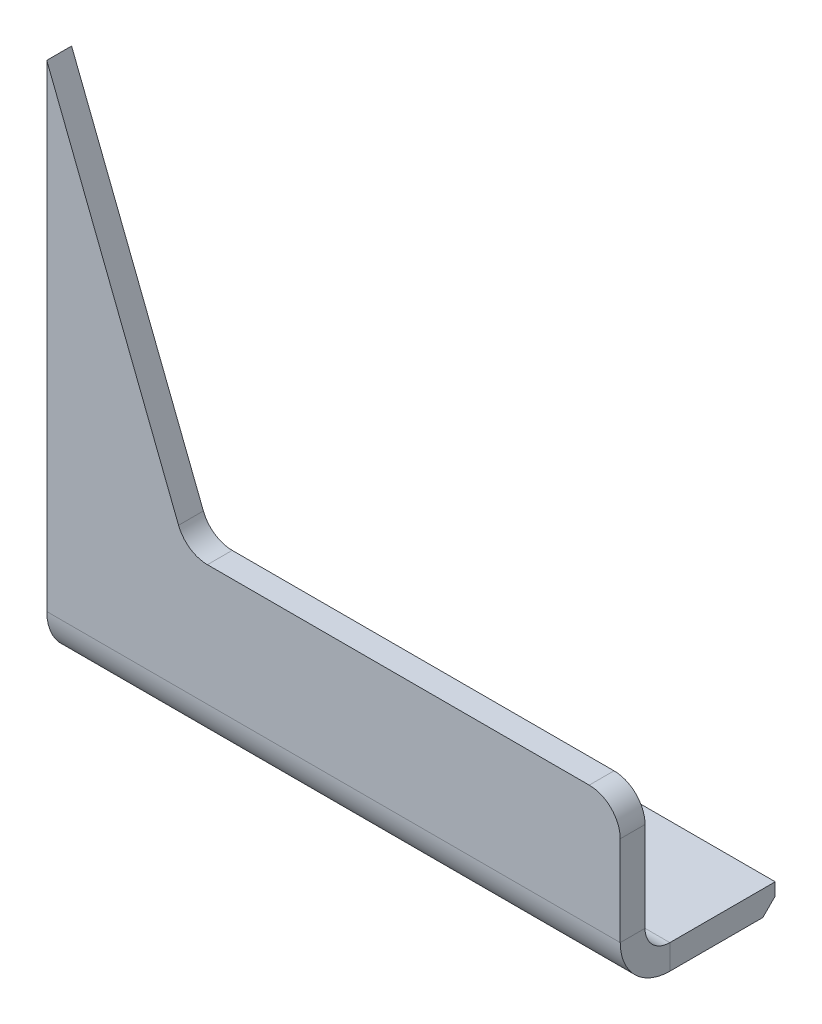
ISO-10303-21;
HEADER;
FILE_DESCRIPTION(('STEP AP214'),'2;1');
FILE_NAME('part.step','',(''),(''),'','','');
FILE_SCHEMA(('AUTOMOTIVE_DESIGN { 1 0 10303 214 1 1 1 1 }'));
ENDSEC;
DATA;
#1=APPLICATION_CONTEXT('core data for automotive mechanical design processes');
#2=APPLICATION_PROTOCOL_DEFINITION('international standard','automotive_design',2000,#1);
#3=PRODUCT_CONTEXT('',#1,'mechanical');
#4=PRODUCT('Part','Part','',(#3));
#5=PRODUCT_RELATED_PRODUCT_CATEGORY('part','',(#4));
#6=PRODUCT_DEFINITION_FORMATION('','',#4);
#7=PRODUCT_DEFINITION_CONTEXT('part definition',#1,'design');
#8=PRODUCT_DEFINITION('design','',#6,#7);
#9=PRODUCT_DEFINITION_SHAPE('','',#8);
#10=(LENGTH_UNIT() NAMED_UNIT(*) SI_UNIT(.MILLI.,.METRE.));
#11=(NAMED_UNIT(*) PLANE_ANGLE_UNIT() SI_UNIT($,.RADIAN.));
#12=(NAMED_UNIT(*) SI_UNIT($,.STERADIAN.) SOLID_ANGLE_UNIT());
#13=UNCERTAINTY_MEASURE_WITH_UNIT(LENGTH_MEASURE(1.E-05),#10,'distance_accuracy_value','');
#14=(GEOMETRIC_REPRESENTATION_CONTEXT(3) GLOBAL_UNCERTAINTY_ASSIGNED_CONTEXT((#13)) GLOBAL_UNIT_ASSIGNED_CONTEXT((#10,
#11,#12)) REPRESENTATION_CONTEXT('',''));
#15=CARTESIAN_POINT('',(0.,0.,0.));
#16=DIRECTION('',(0.,0.,1.));
#17=DIRECTION('',(1.,0.,0.));
#18=AXIS2_PLACEMENT_3D('',#15,#16,#17);
#19=CARTESIAN_POINT('',(0.,0.,-8.00000000000001));
#20=DIRECTION('',(-1.,0.,0.));
#21=DIRECTION('',(0.,-0.999999999999972,0.));
#22=AXIS2_PLACEMENT_3D('',#19,#20,#21);
#23=PLANE('',#22);
#24=DIRECTION('',(0.,-0.999999999999972,0.));
#25=VECTOR('',#24,1.);
#26=CARTESIAN_POINT('',(0.,0.,-8.00000000000001));
#27=LINE('',#26,#25);
#28=CARTESIAN_POINT('',(0.,0.,-8.00000000000001));
#29=VERTEX_POINT('',#28);
#30=CARTESIAN_POINT('',(0.,-153.999999999995,-8.00000000000001));
#31=VERTEX_POINT('',#30);
#32=EDGE_CURVE('E200',#29,#31,#27,.T.);
#33=ORIENTED_EDGE('',*,*,#32,.T.);
#34=DIRECTION('',(0.,0.,0.999999999999972));
#35=VECTOR('',#34,1.);
#36=CARTESIAN_POINT('',(0.,-153.999999999995,-8.00000000000001));
#37=LINE('',#36,#35);
#38=CARTESIAN_POINT('',(0.,-153.999999999995,0.));
#39=VERTEX_POINT('',#38);
#40=EDGE_CURVE('E187',#31,#39,#37,.T.);
#41=ORIENTED_EDGE('',*,*,#40,.T.);
#42=DIRECTION('',(0.,-0.999999999999972,0.));
#43=VECTOR('',#42,1.);
#44=CARTESIAN_POINT('',(0.,0.,0.));
#45=LINE('',#44,#43);
#46=CARTESIAN_POINT('',(0.,0.,0.));
#47=VERTEX_POINT('',#46);
#48=EDGE_CURVE('E198',#47,#39,#45,.T.);
#49=ORIENTED_EDGE('',*,*,#48,.F.);
#50=DIRECTION('',(0.,0.,0.999999999999972));
#51=VECTOR('',#50,1.);
#52=CARTESIAN_POINT('',(0.,0.,-8.00000000000001));
#53=LINE('',#52,#51);
#54=EDGE_CURVE('E212',#29,#47,#53,.T.);
#55=ORIENTED_EDGE('',*,*,#54,.F.);
#56=EDGE_LOOP('',(#33,#41,#49,#55));
#57=FACE_BOUND('',#56,.T.);
#58=ADVANCED_FACE('F58',(#57),#23,.T.);
#59=CARTESIAN_POINT('',(0.,0.,-8.00000000000001));
#60=DIRECTION('',(0.,0.,0.999999999999972));
#61=DIRECTION('',(1.,0.,0.));
#62=AXIS2_PLACEMENT_3D('',#59,#60,#61);
#63=PLANE('',#62);
#64=DIRECTION('',(-1.,0.,0.));
#65=VECTOR('',#64,1.);
#66=CARTESIAN_POINT('',(44.9999999999999,-114.999999999995,-8.00000000000001));
#67=LINE('',#66,#65);
#68=CARTESIAN_POINT('',(175.,-114.999999999995,-8.00000000000001));
#69=VERTEX_POINT('',#68);
#70=CARTESIAN_POINT('',(51.8252948132423,-114.999999999997,-8.00000000000001));
#71=VERTEX_POINT('',#70);
#72=EDGE_CURVE('E207',#69,#71,#67,.T.);
#73=ORIENTED_EDGE('',*,*,#72,.F.);
#74=CARTESIAN_POINT('',(175.,-124.999999999995,-8.00000000000001));
#75=DIRECTION('',(0.,0.,0.999999999999972));
#76=DIRECTION('',(1.,0.,0.));
#77=AXIS2_PLACEMENT_3D('',#74,#75,#76);
#78=CIRCLE('',#77,10.);
#79=CARTESIAN_POINT('',(185.,-124.999999999995,-8.00000000000001));
#80=VERTEX_POINT('',#79);
#81=EDGE_CURVE('E234',#69,#80,#78,.F.);
#82=ORIENTED_EDGE('',*,*,#81,.T.);
#83=DIRECTION('',(0.,0.999999999999972,0.));
#84=VECTOR('',#83,1.);
#85=CARTESIAN_POINT('',(185.,-114.999999999995,-8.00000000000001));
#86=LINE('',#85,#84);
#87=CARTESIAN_POINT('',(185.,-153.999999999995,-8.00000000000001));
#88=VERTEX_POINT('',#87);
#89=EDGE_CURVE('E203',#88,#80,#86,.T.);
#90=ORIENTED_EDGE('',*,*,#89,.F.);
#91=DIRECTION('',(-1.,0.,0.));
#92=VECTOR('',#91,1.);
#93=CARTESIAN_POINT('',(0.,-153.999999999995,-8.00000000000001));
#94=LINE('',#93,#92);
#95=EDGE_CURVE('E191',#31,#88,#94,.F.);
#96=ORIENTED_EDGE('',*,*,#95,.F.);
#97=ORIENTED_EDGE('',*,*,#32,.F.);
#98=DIRECTION('',(-0.364399348580512,0.931242779705726,0.));
#99=VECTOR('',#98,1.);
#100=CARTESIAN_POINT('',(0.,0.,-8.00000000000001));
#101=LINE('',#100,#99);
#102=CARTESIAN_POINT('',(42.5128670161847,-108.643993485802,-8.00000000000001));
#103=VERTEX_POINT('',#102);
#104=EDGE_CURVE('E210',#103,#29,#101,.T.);
#105=ORIENTED_EDGE('',*,*,#104,.F.);
#106=CARTESIAN_POINT('',(51.8252948132423,-104.999999999997,-8.00000000000001));
#107=DIRECTION('',(0.,0.,0.999999999999972));
#108=DIRECTION('',(1.,0.,0.));
#109=AXIS2_PLACEMENT_3D('',#106,#107,#108);
#110=CIRCLE('',#109,10.);
#111=EDGE_CURVE('E240',#103,#71,#110,.T.);
#112=ORIENTED_EDGE('',*,*,#111,.T.);
#113=EDGE_LOOP('',(#73,#82,#90,#96,#97,#105,#112));
#114=FACE_BOUND('',#113,.T.);
#115=ADVANCED_FACE('F272',(#114),#63,.F.);
#116=CARTESIAN_POINT('',(0.,0.,0.));
#117=DIRECTION('',(0.,0.,0.999999999999972));
#118=DIRECTION('',(1.,0.,0.));
#119=AXIS2_PLACEMENT_3D('',#116,#117,#118);
#120=PLANE('',#119);
#121=DIRECTION('',(0.,0.999999999999972,0.));
#122=VECTOR('',#121,1.);
#123=CARTESIAN_POINT('',(185.,-114.999999999995,0.));
#124=LINE('',#123,#122);
#125=CARTESIAN_POINT('',(185.,-153.999999999995,0.));
#126=VERTEX_POINT('',#125);
#127=CARTESIAN_POINT('',(185.,-124.999999999995,0.));
#128=VERTEX_POINT('',#127);
#129=EDGE_CURVE('E215',#126,#128,#124,.T.);
#130=ORIENTED_EDGE('',*,*,#129,.T.);
#131=CARTESIAN_POINT('',(175.,-124.999999999995,0.));
#132=DIRECTION('',(0.,0.,0.999999999999972));
#133=DIRECTION('',(1.,0.,0.));
#134=AXIS2_PLACEMENT_3D('',#131,#132,#133);
#135=CIRCLE('',#134,10.);
#136=CARTESIAN_POINT('',(175.,-114.999999999995,0.));
#137=VERTEX_POINT('',#136);
#138=EDGE_CURVE('E227',#128,#137,#135,.T.);
#139=ORIENTED_EDGE('',*,*,#138,.T.);
#140=DIRECTION('',(-1.,0.,0.));
#141=VECTOR('',#140,1.);
#142=CARTESIAN_POINT('',(44.9999999999999,-114.999999999995,0.));
#143=LINE('',#142,#141);
#144=CARTESIAN_POINT('',(51.8252948132423,-114.999999999997,0.));
#145=VERTEX_POINT('',#144);
#146=EDGE_CURVE('E218',#137,#145,#143,.T.);
#147=ORIENTED_EDGE('',*,*,#146,.T.);
#148=CARTESIAN_POINT('',(51.8252948132423,-104.999999999997,0.));
#149=DIRECTION('',(0.,0.,0.999999999999972));
#150=DIRECTION('',(1.,0.,0.));
#151=AXIS2_PLACEMENT_3D('',#148,#149,#150);
#152=CIRCLE('',#151,10.);
#153=CARTESIAN_POINT('',(42.5128670161847,-108.643993485802,0.));
#154=VERTEX_POINT('',#153);
#155=EDGE_CURVE('E238',#145,#154,#152,.F.);
#156=ORIENTED_EDGE('',*,*,#155,.T.);
#157=DIRECTION('',(-0.364399348580512,0.931242779705726,0.));
#158=VECTOR('',#157,1.);
#159=CARTESIAN_POINT('',(0.,0.,0.));
#160=LINE('',#159,#158);
#161=EDGE_CURVE('E204',#154,#47,#160,.T.);
#162=ORIENTED_EDGE('',*,*,#161,.T.);
#163=ORIENTED_EDGE('',*,*,#48,.T.);
#164=DIRECTION('',(-1.,0.,0.));
#165=VECTOR('',#164,1.);
#166=CARTESIAN_POINT('',(0.,-153.999999999995,0.));
#167=LINE('',#166,#165);
#168=EDGE_CURVE('E161',#39,#126,#167,.F.);
#169=ORIENTED_EDGE('',*,*,#168,.T.);
#170=EDGE_LOOP('',(#130,#139,#147,#156,#162,#163,#169));
#171=FACE_BOUND('',#170,.T.);
#172=ADVANCED_FACE('F278',(#171),#120,.T.);
#173=CARTESIAN_POINT('',(0.,0.,-8.00000000000001));
#174=DIRECTION('',(0.931242779705754,0.364399348580505,0.));
#175=DIRECTION('',(-0.364399348580512,0.931242779705726,0.));
#176=AXIS2_PLACEMENT_3D('',#173,#174,#175);
#177=PLANE('',#176);
#178=ORIENTED_EDGE('',*,*,#161,.F.);
#179=DIRECTION('',(0.,0.,0.999999999999972));
#180=VECTOR('',#179,1.);
#181=CARTESIAN_POINT('',(42.5128670161847,-108.643993485802,-8.00000000000001));
#182=LINE('',#181,#180);
#183=EDGE_CURVE('E236',#154,#103,#182,.F.);
#184=ORIENTED_EDGE('',*,*,#183,.T.);
#185=ORIENTED_EDGE('',*,*,#104,.T.);
#186=ORIENTED_EDGE('',*,*,#54,.T.);
#187=EDGE_LOOP('',(#178,#184,#185,#186));
#188=FACE_BOUND('',#187,.T.);
#189=ADVANCED_FACE('F318',(#188),#177,.T.);
#190=CARTESIAN_POINT('',(44.9999999999999,-114.999999999995,-8.00000000000001));
#191=DIRECTION('',(0.,0.999999999999972,0.));
#192=DIRECTION('',(0.,0.,0.999999999999972));
#193=AXIS2_PLACEMENT_3D('',#190,#191,#192);
#194=PLANE('',#193);
#195=ORIENTED_EDGE('',*,*,#146,.F.);
#196=DIRECTION('',(0.,0.,0.999999999999972));
#197=VECTOR('',#196,1.);
#198=CARTESIAN_POINT('',(175.,-114.999999999995,-8.00000000000001));
#199=LINE('',#198,#197);
#200=EDGE_CURVE('E232',#137,#69,#199,.F.);
#201=ORIENTED_EDGE('',*,*,#200,.T.);
#202=ORIENTED_EDGE('',*,*,#72,.T.);
#203=DIRECTION('',(0.,0.,0.999999999999972));
#204=VECTOR('',#203,1.);
#205=CARTESIAN_POINT('',(51.8252948132423,-114.999999999997,0.));
#206=LINE('',#205,#204);
#207=EDGE_CURVE('E229',#71,#145,#206,.T.);
#208=ORIENTED_EDGE('',*,*,#207,.T.);
#209=EDGE_LOOP('',(#195,#201,#202,#208));
#210=FACE_BOUND('',#209,.T.);
#211=ADVANCED_FACE('F317',(#210),#194,.T.);
#212=CARTESIAN_POINT('',(185.,-114.999999999995,-8.00000000000001));
#213=DIRECTION('',(1.,0.,0.));
#214=DIRECTION('',(0.,0.999999999999972,0.));
#215=AXIS2_PLACEMENT_3D('',#212,#213,#214);
#216=PLANE('',#215);
#217=ORIENTED_EDGE('',*,*,#89,.T.);
#218=DIRECTION('',(0.,0.,0.999999999999972));
#219=VECTOR('',#218,1.);
#220=CARTESIAN_POINT('',(185.,-124.999999999995,-8.00000000000001));
#221=LINE('',#220,#219);
#222=EDGE_CURVE('E224',#80,#128,#221,.T.);
#223=ORIENTED_EDGE('',*,*,#222,.T.);
#224=ORIENTED_EDGE('',*,*,#129,.F.);
#225=DIRECTION('',(0.,0.,0.999999999999972));
#226=VECTOR('',#225,1.);
#227=CARTESIAN_POINT('',(185.,-153.999999999995,-8.00000000000001));
#228=LINE('',#227,#226);
#229=EDGE_CURVE('E195',#88,#126,#228,.T.);
#230=ORIENTED_EDGE('',*,*,#229,.F.);
#231=EDGE_LOOP('',(#217,#223,#224,#230));
#232=FACE_BOUND('',#231,.T.);
#233=ADVANCED_FACE('F283',(#232),#216,.T.);
#234=CARTESIAN_POINT('',(185.,-153.999999999995,-16.));
#235=DIRECTION('',(1.,0.,0.));
#236=DIRECTION('',(0.,0.,-0.999999999999972));
#237=AXIS2_PLACEMENT_3D('',#234,#235,#236);
#238=PLANE('',#237);
#239=DIRECTION('',(0.,-0.999999999999972,0.));
#240=VECTOR('',#239,1.);
#241=CARTESIAN_POINT('',(185.,-169.999999999995,-16.));
#242=LINE('',#241,#240);
#243=CARTESIAN_POINT('',(185.,-161.999999999995,-16.));
#244=VERTEX_POINT('',#243);
#245=CARTESIAN_POINT('',(185.,-169.999999999995,-16.));
#246=VERTEX_POINT('',#245);
#247=EDGE_CURVE('E182',#244,#246,#242,.T.);
#248=ORIENTED_EDGE('',*,*,#247,.F.);
#249=CARTESIAN_POINT('',(185.,-153.999999999995,-16.));
#250=DIRECTION('',(-1.,0.,0.));
#251=DIRECTION('',(0.,0.,0.999999999999972));
#252=AXIS2_PLACEMENT_3D('',#249,#250,#251);
#253=CIRCLE('',#252,8.00000000000001);
#254=EDGE_CURVE('E164',#88,#244,#253,.F.);
#255=ORIENTED_EDGE('',*,*,#254,.F.);
#256=ORIENTED_EDGE('',*,*,#229,.T.);
#257=CARTESIAN_POINT('',(185.,-153.999999999995,-16.));
#258=DIRECTION('',(-1.,0.,0.));
#259=DIRECTION('',(0.,0.,0.999999999999972));
#260=AXIS2_PLACEMENT_3D('',#257,#258,#259);
#261=CIRCLE('',#260,16.);
#262=EDGE_CURVE('E186',#126,#246,#261,.F.);
#263=ORIENTED_EDGE('',*,*,#262,.T.);
#264=EDGE_LOOP('',(#248,#255,#256,#263));
#265=FACE_BOUND('',#264,.T.);
#266=ADVANCED_FACE('F302',(#265),#238,.T.);
#267=CARTESIAN_POINT('',(0.,-153.999999999995,-16.));
#268=DIRECTION('',(1.,0.,0.));
#269=DIRECTION('',(0.,0.,-0.999999999999972));
#270=AXIS2_PLACEMENT_3D('',#267,#268,#269);
#271=PLANE('',#270);
#272=CARTESIAN_POINT('',(0.,-153.999999999995,-16.));
#273=DIRECTION('',(-1.,0.,0.));
#274=DIRECTION('',(0.,0.,0.999999999999972));
#275=AXIS2_PLACEMENT_3D('',#272,#273,#274);
#276=CIRCLE('',#275,8.00000000000001);
#277=CARTESIAN_POINT('',(0.,-161.999999999995,-16.));
#278=VERTEX_POINT('',#277);
#279=EDGE_CURVE('E169',#278,#31,#276,.T.);
#280=ORIENTED_EDGE('',*,*,#279,.F.);
#281=DIRECTION('',(0.,-0.999999999999972,0.));
#282=VECTOR('',#281,1.);
#283=CARTESIAN_POINT('',(0.,-161.999999999995,-16.));
#284=LINE('',#283,#282);
#285=CARTESIAN_POINT('',(0.,-169.999999999995,-16.));
#286=VERTEX_POINT('',#285);
#287=EDGE_CURVE('E149',#278,#286,#284,.T.);
#288=ORIENTED_EDGE('',*,*,#287,.T.);
#289=CARTESIAN_POINT('',(0.,-153.999999999995,-16.));
#290=DIRECTION('',(-1.,0.,0.));
#291=DIRECTION('',(0.,0.,0.999999999999972));
#292=AXIS2_PLACEMENT_3D('',#289,#290,#291);
#293=CIRCLE('',#292,16.);
#294=EDGE_CURVE('E156',#286,#39,#293,.T.);
#295=ORIENTED_EDGE('',*,*,#294,.T.);
#296=ORIENTED_EDGE('',*,*,#40,.F.);
#297=EDGE_LOOP('',(#280,#288,#295,#296));
#298=FACE_BOUND('',#297,.T.);
#299=ADVANCED_FACE('F167',(#298),#271,.F.);
#300=CARTESIAN_POINT('',(0.,-153.999999999995,-16.));
#301=DIRECTION('',(-1.,0.,0.));
#302=DIRECTION('',(0.,-0.999999999999972,0.));
#303=AXIS2_PLACEMENT_3D('',#300,#301,#302);
#304=CYLINDRICAL_SURFACE('',#303,16.);
#305=ORIENTED_EDGE('',*,*,#168,.F.);
#306=ORIENTED_EDGE('',*,*,#294,.F.);
#307=DIRECTION('',(-1.,0.,0.));
#308=VECTOR('',#307,1.);
#309=CARTESIAN_POINT('',(0.,-169.999999999995,-16.));
#310=LINE('',#309,#308);
#311=EDGE_CURVE('E158',#246,#286,#310,.T.);
#312=ORIENTED_EDGE('',*,*,#311,.F.);
#313=ORIENTED_EDGE('',*,*,#262,.F.);
#314=EDGE_LOOP('',(#305,#306,#312,#313));
#315=FACE_BOUND('',#314,.T.);
#316=ADVANCED_FACE('F157',(#315),#304,.T.);
#317=CARTESIAN_POINT('',(0.,-153.999999999995,-16.));
#318=DIRECTION('',(-1.,0.,0.));
#319=DIRECTION('',(0.,-0.999999999999972,0.));
#320=AXIS2_PLACEMENT_3D('',#317,#318,#319);
#321=CYLINDRICAL_SURFACE('',#320,8.00000000000001);
#322=ORIENTED_EDGE('',*,*,#95,.T.);
#323=ORIENTED_EDGE('',*,*,#254,.T.);
#324=DIRECTION('',(1.,0.,0.));
#325=VECTOR('',#324,1.);
#326=CARTESIAN_POINT('',(185.,-161.999999999995,-16.));
#327=LINE('',#326,#325);
#328=EDGE_CURVE('E171',#244,#278,#327,.F.);
#329=ORIENTED_EDGE('',*,*,#328,.T.);
#330=ORIENTED_EDGE('',*,*,#279,.T.);
#331=EDGE_LOOP('',(#322,#323,#329,#330));
#332=FACE_BOUND('',#331,.T.);
#333=ADVANCED_FACE('F309',(#332),#321,.F.);
#334=CARTESIAN_POINT('',(0.,-169.999999999995,-8.00000000000001));
#335=DIRECTION('',(-1.,0.,0.));
#336=DIRECTION('',(0.,0.,0.999999999999972));
#337=AXIS2_PLACEMENT_3D('',#334,#335,#336);
#338=PLANE('',#337);
#339=DIRECTION('',(0.,0.999999999999972,0.));
#340=VECTOR('',#339,1.);
#341=CARTESIAN_POINT('',(0.,-169.999999999995,-49.9999999999978));
#342=LINE('',#341,#340);
#343=CARTESIAN_POINT('',(0.,-165.999999999995,-49.9999999999978));
#344=VERTEX_POINT('',#343);
#345=CARTESIAN_POINT('',(0.,-161.999999999995,-49.9999999999978));
#346=VERTEX_POINT('',#345);
#347=EDGE_CURVE('E194',#344,#346,#342,.T.);
#348=ORIENTED_EDGE('',*,*,#347,.F.);
#349=DIRECTION('',(0.,0.707106781186529,-0.707106781186539));
#350=VECTOR('',#349,1.);
#351=CARTESIAN_POINT('',(-9.99200722162641E-13,-188.999999999993,-26.9999999999999));
#352=LINE('',#351,#350);
#353=CARTESIAN_POINT('',(0.,-169.999999999995,-46.));
#354=VERTEX_POINT('',#353);
#355=EDGE_CURVE('E80',#344,#354,#352,.F.);
#356=ORIENTED_EDGE('',*,*,#355,.T.);
#357=DIRECTION('',(0.,0.,0.999999999999972));
#358=VECTOR('',#357,1.);
#359=CARTESIAN_POINT('',(0.,-169.999999999995,-8.00000000000001));
#360=LINE('',#359,#358);
#361=EDGE_CURVE('E144',#354,#286,#360,.T.);
#362=ORIENTED_EDGE('',*,*,#361,.T.);
#363=ORIENTED_EDGE('',*,*,#287,.F.);
#364=DIRECTION('',(0.,0.,-0.999999999999972));
#365=VECTOR('',#364,1.);
#366=CARTESIAN_POINT('',(0.,-161.999999999995,6.66133814775094E-13));
#367=LINE('',#366,#365);
#368=EDGE_CURVE('E253',#346,#278,#367,.F.);
#369=ORIENTED_EDGE('',*,*,#368,.F.);
#370=EDGE_LOOP('',(#348,#356,#362,#363,#369));
#371=FACE_BOUND('',#370,.T.);
#372=ADVANCED_FACE('F146',(#371),#338,.T.);
#373=CARTESIAN_POINT('',(185.,-169.999999999995,-49.9999999999978));
#374=DIRECTION('',(1.,0.,0.));
#375=DIRECTION('',(0.,0.,-0.999999999999972));
#376=AXIS2_PLACEMENT_3D('',#373,#374,#375);
#377=PLANE('',#376);
#378=DIRECTION('',(0.,0.,-0.999999999999972));
#379=VECTOR('',#378,1.);
#380=CARTESIAN_POINT('',(185.,-169.999999999995,-49.9999999999978));
#381=LINE('',#380,#379);
#382=CARTESIAN_POINT('',(185.,-169.999999999995,-46.));
#383=VERTEX_POINT('',#382);
#384=EDGE_CURVE('E152',#246,#383,#381,.T.);
#385=ORIENTED_EDGE('',*,*,#384,.T.);
#386=DIRECTION('',(0.,-0.707106781186529,0.707106781186539));
#387=VECTOR('',#386,1.);
#388=CARTESIAN_POINT('',(185.,-167.999999999995,-48.));
#389=LINE('',#388,#387);
#390=CARTESIAN_POINT('',(185.,-165.999999999995,-49.9999999999978));
#391=VERTEX_POINT('',#390);
#392=EDGE_CURVE('E13',#383,#391,#389,.F.);
#393=ORIENTED_EDGE('',*,*,#392,.T.);
#394=DIRECTION('',(0.,0.999999999999972,0.));
#395=VECTOR('',#394,1.);
#396=CARTESIAN_POINT('',(185.,-169.999999999995,-49.9999999999978));
#397=LINE('',#396,#395);
#398=CARTESIAN_POINT('',(185.,-161.999999999995,-49.9999999999978));
#399=VERTEX_POINT('',#398);
#400=EDGE_CURVE('E151',#391,#399,#397,.T.);
#401=ORIENTED_EDGE('',*,*,#400,.T.);
#402=DIRECTION('',(0.,0.,0.999999999999972));
#403=VECTOR('',#402,1.);
#404=CARTESIAN_POINT('',(185.,-161.999999999995,6.66133814775094E-13));
#405=LINE('',#404,#403);
#406=EDGE_CURVE('E174',#244,#399,#405,.F.);
#407=ORIENTED_EDGE('',*,*,#406,.F.);
#408=ORIENTED_EDGE('',*,*,#247,.T.);
#409=EDGE_LOOP('',(#385,#393,#401,#407,#408));
#410=FACE_BOUND('',#409,.T.);
#411=ADVANCED_FACE('F263',(#410),#377,.T.);
#412=CARTESIAN_POINT('',(0.,-169.999999999995,6.66133814775094E-13));
#413=DIRECTION('',(0.,-0.999999999999972,0.));
#414=DIRECTION('',(0.,0.,-0.999999999999972));
#415=AXIS2_PLACEMENT_3D('',#412,#413,#414);
#416=PLANE('',#415);
#417=ORIENTED_EDGE('',*,*,#361,.F.);
#418=DIRECTION('',(1.,0.,0.));
#419=VECTOR('',#418,1.);
#420=CARTESIAN_POINT('',(0.,-169.999999999995,-46.));
#421=LINE('',#420,#419);
#422=EDGE_CURVE('E66',#354,#383,#421,.T.);
#423=ORIENTED_EDGE('',*,*,#422,.T.);
#424=ORIENTED_EDGE('',*,*,#384,.F.);
#425=ORIENTED_EDGE('',*,*,#311,.T.);
#426=EDGE_LOOP('',(#417,#423,#424,#425));
#427=FACE_BOUND('',#426,.T.);
#428=ADVANCED_FACE('F173',(#427),#416,.T.);
#429=CARTESIAN_POINT('',(0.,-161.999999999995,6.66133814775094E-13));
#430=DIRECTION('',(0.,-0.999999999999972,0.));
#431=DIRECTION('',(0.,0.,-0.999999999999972));
#432=AXIS2_PLACEMENT_3D('',#429,#430,#431);
#433=PLANE('',#432);
#434=ORIENTED_EDGE('',*,*,#328,.F.);
#435=ORIENTED_EDGE('',*,*,#406,.T.);
#436=DIRECTION('',(1.,0.,0.));
#437=VECTOR('',#436,1.);
#438=CARTESIAN_POINT('',(0.,-161.999999999995,-49.9999999999978));
#439=LINE('',#438,#437);
#440=EDGE_CURVE('E177',#399,#346,#439,.F.);
#441=ORIENTED_EDGE('',*,*,#440,.T.);
#442=ORIENTED_EDGE('',*,*,#368,.T.);
#443=EDGE_LOOP('',(#434,#435,#441,#442));
#444=FACE_BOUND('',#443,.T.);
#445=ADVANCED_FACE('F260',(#444),#433,.F.);
#446=CARTESIAN_POINT('',(0.,-169.999999999995,-49.9999999999978));
#447=DIRECTION('',(0.,0.,-0.999999999999972));
#448=DIRECTION('',(0.,0.999999999999972,0.));
#449=AXIS2_PLACEMENT_3D('',#446,#447,#448);
#450=PLANE('',#449);
#451=ORIENTED_EDGE('',*,*,#400,.F.);
#452=DIRECTION('',(-1.,0.,0.));
#453=VECTOR('',#452,1.);
#454=CARTESIAN_POINT('',(0.,-165.999999999995,-49.9999999999978));
#455=LINE('',#454,#453);
#456=EDGE_CURVE('E242',#391,#344,#455,.T.);
#457=ORIENTED_EDGE('',*,*,#456,.T.);
#458=ORIENTED_EDGE('',*,*,#347,.T.);
#459=ORIENTED_EDGE('',*,*,#440,.F.);
#460=EDGE_LOOP('',(#451,#457,#458,#459));
#461=FACE_BOUND('',#460,.T.);
#462=ADVANCED_FACE('F248',(#461),#450,.T.);
#463=CARTESIAN_POINT('',(175.,-124.999999999995,-8.00000000000001));
#464=DIRECTION('',(0.,0.,0.999999999999972));
#465=DIRECTION('',(1.,0.,0.));
#466=AXIS2_PLACEMENT_3D('',#463,#464,#465);
#467=CYLINDRICAL_SURFACE('',#466,10.);
#468=ORIENTED_EDGE('',*,*,#81,.F.);
#469=ORIENTED_EDGE('',*,*,#200,.F.);
#470=ORIENTED_EDGE('',*,*,#138,.F.);
#471=ORIENTED_EDGE('',*,*,#222,.F.);
#472=EDGE_LOOP('',(#468,#469,#470,#471));
#473=FACE_BOUND('',#472,.T.);
#474=ADVANCED_FACE('F269',(#473),#467,.T.);
#475=CARTESIAN_POINT('',(51.8252948132423,-104.999999999997,-8.00000000000001));
#476=DIRECTION('',(0.,0.,-0.999999999999972));
#477=DIRECTION('',(-1.,0.,0.));
#478=AXIS2_PLACEMENT_3D('',#475,#476,#477);
#479=CYLINDRICAL_SURFACE('',#478,10.);
#480=ORIENTED_EDGE('',*,*,#111,.F.);
#481=ORIENTED_EDGE('',*,*,#183,.F.);
#482=ORIENTED_EDGE('',*,*,#155,.F.);
#483=ORIENTED_EDGE('',*,*,#207,.F.);
#484=EDGE_LOOP('',(#480,#481,#482,#483));
#485=FACE_BOUND('',#484,.T.);
#486=ADVANCED_FACE('F265',(#485),#479,.F.);
#487=CARTESIAN_POINT('',(0.,-165.999999999995,-49.9999999999978));
#488=DIRECTION('',(0.,0.707106781186539,0.707106781186529));
#489=DIRECTION('',(-1.,0.,0.));
#490=AXIS2_PLACEMENT_3D('',#487,#488,#489);
#491=PLANE('',#490);
#492=ORIENTED_EDGE('',*,*,#392,.F.);
#493=ORIENTED_EDGE('',*,*,#422,.F.);
#494=ORIENTED_EDGE('',*,*,#355,.F.);
#495=ORIENTED_EDGE('',*,*,#456,.F.);
#496=EDGE_LOOP('',(#492,#493,#494,#495));
#497=FACE_BOUND('',#496,.T.);
#498=ADVANCED_FACE('F60',(#497),#491,.F.);
#499=CLOSED_SHELL('',(#58,#115,#172,#189,#211,#233,#266,#299,#316,#333,#372,#411,#428,#445,#462,
#474,#486,#498));
#500=MANIFOLD_SOLID_BREP('B2',#499);
#501=ADVANCED_BREP_SHAPE_REPRESENTATION('',(#18,#500),#14);
#502=SHAPE_DEFINITION_REPRESENTATION(#9,#501);
ENDSEC;
END-ISO-10303-21;
